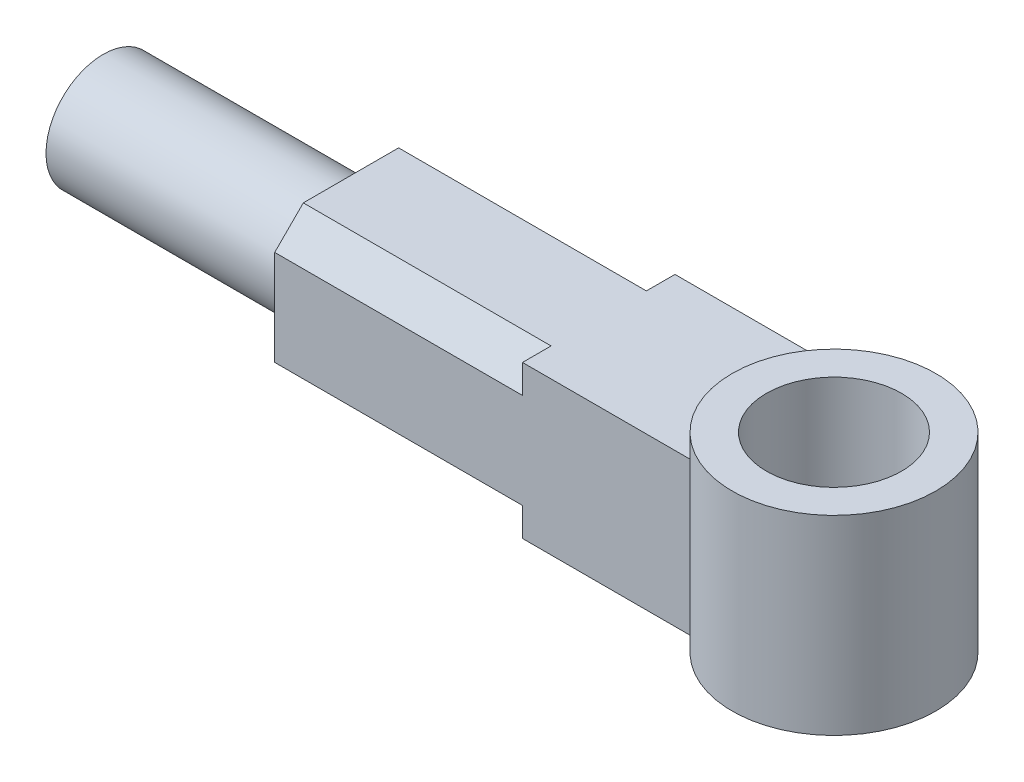
ISO-10303-21;
HEADER;
FILE_DESCRIPTION(('STEP AP214'),'2;1');
FILE_NAME('part.step','',(''),(''),'','','');
FILE_SCHEMA(('AUTOMOTIVE_DESIGN { 1 0 10303 214 1 1 1 1 }'));
ENDSEC;
DATA;
#1=APPLICATION_CONTEXT('core data for automotive mechanical design processes');
#2=APPLICATION_PROTOCOL_DEFINITION('international standard','automotive_design',2000,#1);
#3=PRODUCT_CONTEXT('',#1,'mechanical');
#4=PRODUCT('Part','Part','',(#3));
#5=PRODUCT_RELATED_PRODUCT_CATEGORY('part','',(#4));
#6=PRODUCT_DEFINITION_FORMATION('','',#4);
#7=PRODUCT_DEFINITION_CONTEXT('part definition',#1,'design');
#8=PRODUCT_DEFINITION('design','',#6,#7);
#9=PRODUCT_DEFINITION_SHAPE('','',#8);
#10=(LENGTH_UNIT() NAMED_UNIT(*) SI_UNIT(.MILLI.,.METRE.));
#11=(NAMED_UNIT(*) PLANE_ANGLE_UNIT() SI_UNIT($,.RADIAN.));
#12=(NAMED_UNIT(*) SI_UNIT($,.STERADIAN.) SOLID_ANGLE_UNIT());
#13=UNCERTAINTY_MEASURE_WITH_UNIT(LENGTH_MEASURE(1.E-05),#10,'distance_accuracy_value','');
#14=(GEOMETRIC_REPRESENTATION_CONTEXT(3) GLOBAL_UNCERTAINTY_ASSIGNED_CONTEXT((#13)) GLOBAL_UNIT_ASSIGNED_CONTEXT((#10,
#11,#12)) REPRESENTATION_CONTEXT('',''));
#15=CARTESIAN_POINT('',(0.,0.,0.));
#16=DIRECTION('',(0.,0.,1.));
#17=DIRECTION('',(1.,0.,0.));
#18=AXIS2_PLACEMENT_3D('',#15,#16,#17);
#19=CARTESIAN_POINT('',(-140.311288741493,0.,20.));
#20=DIRECTION('',(1.,0.,0.));
#21=DIRECTION('',(0.,0.,-1.));
#22=AXIS2_PLACEMENT_3D('',#19,#20,#21);
#23=PLANE('',#22);
#24=DIRECTION('',(0.,-1.,0.));
#25=VECTOR('',#24,1.);
#26=CARTESIAN_POINT('',(-140.311288741493,0.,-20.));
#27=LINE('',#26,#25);
#28=CARTESIAN_POINT('',(-140.311288741493,12.5,-20.));
#29=VERTEX_POINT('',#28);
#30=CARTESIAN_POINT('',(-140.311288741493,-12.4999999999998,-20.0000000000002));
#31=VERTEX_POINT('',#30);
#32=EDGE_CURVE('E162',#29,#31,#27,.T.);
#33=ORIENTED_EDGE('',*,*,#32,.T.);
#34=DIRECTION('',(0.,0.707106781186552,-0.707106781186543));
#35=VECTOR('',#34,1.);
#36=CARTESIAN_POINT('',(-140.311288741493,-12.4999999999998,-20.0000000000002));
#37=LINE('',#36,#35);
#38=CARTESIAN_POINT('',(-140.311288741493,-19.9999999999999,-12.5000000000002));
#39=VERTEX_POINT('',#38);
#40=EDGE_CURVE('E187',#39,#31,#37,.T.);
#41=ORIENTED_EDGE('',*,*,#40,.F.);
#42=DIRECTION('',(0.,0.,-1.));
#43=VECTOR('',#42,1.);
#44=CARTESIAN_POINT('',(-140.311288741493,-20.,20.));
#45=LINE('',#44,#43);
#46=CARTESIAN_POINT('',(-140.311288741493,-20.,12.5));
#47=VERTEX_POINT('',#46);
#48=EDGE_CURVE('E175',#47,#39,#45,.T.);
#49=ORIENTED_EDGE('',*,*,#48,.F.);
#50=DIRECTION('',(0.,-0.70710678118655,-0.707106781186545));
#51=VECTOR('',#50,1.);
#52=CARTESIAN_POINT('',(-140.311288741493,-20.,12.5));
#53=LINE('',#52,#51);
#54=CARTESIAN_POINT('',(-140.311288741493,-12.5,20.));
#55=VERTEX_POINT('',#54);
#56=EDGE_CURVE('E209',#55,#47,#53,.T.);
#57=ORIENTED_EDGE('',*,*,#56,.F.);
#58=DIRECTION('',(0.,-1.,0.));
#59=VECTOR('',#58,1.);
#60=CARTESIAN_POINT('',(-140.311288741493,0.,20.));
#61=LINE('',#60,#59);
#62=CARTESIAN_POINT('',(-140.311288741493,12.5,20.));
#63=VERTEX_POINT('',#62);
#64=EDGE_CURVE('E180',#63,#55,#61,.T.);
#65=ORIENTED_EDGE('',*,*,#64,.F.);
#66=DIRECTION('',(0.,-0.707106781186547,0.707106781186548));
#67=VECTOR('',#66,1.);
#68=CARTESIAN_POINT('',(-140.311288741493,12.5,20.));
#69=LINE('',#68,#67);
#70=CARTESIAN_POINT('',(-140.311288741493,20.,12.5));
#71=VERTEX_POINT('',#70);
#72=EDGE_CURVE('E230',#71,#63,#69,.T.);
#73=ORIENTED_EDGE('',*,*,#72,.F.);
#74=DIRECTION('',(0.,0.,-1.));
#75=VECTOR('',#74,1.);
#76=CARTESIAN_POINT('',(-140.311288741493,20.,20.));
#77=LINE('',#76,#75);
#78=CARTESIAN_POINT('',(-140.311288741493,20.,-12.5));
#79=VERTEX_POINT('',#78);
#80=EDGE_CURVE('E179',#71,#79,#77,.T.);
#81=ORIENTED_EDGE('',*,*,#80,.T.);
#82=DIRECTION('',(0.,0.70710678118655,0.707106781186545));
#83=VECTOR('',#82,1.);
#84=CARTESIAN_POINT('',(-140.311288741493,20.,-12.5));
#85=LINE('',#84,#83);
#86=EDGE_CURVE('E256',#29,#79,#85,.T.);
#87=ORIENTED_EDGE('',*,*,#86,.F.);
#88=EDGE_LOOP('',(#33,#41,#49,#57,#65,#73,#81,#87));
#89=FACE_BOUND('',#88,.T.);
#90=CARTESIAN_POINT('',(-140.311288741493,0.,0.));
#91=DIRECTION('',(1.,0.,0.));
#92=DIRECTION('',(0.,0.,-1.));
#93=AXIS2_PLACEMENT_3D('',#90,#91,#92);
#94=CIRCLE('',#93,15.);
#95=CARTESIAN_POINT('',(-140.311288741493,0.,-15.));
#96=VERTEX_POINT('',#95);
#97=EDGE_CURVE('E60',#96,#96,#94,.F.);
#98=ORIENTED_EDGE('',*,*,#97,.F.);
#99=EDGE_LOOP('',(#98));
#100=FACE_BOUND('',#99,.T.);
#101=ADVANCED_FACE('F50',(#89,#100),#23,.F.);
#102=CARTESIAN_POINT('',(0.,-20.,20.));
#103=DIRECTION('',(0.,-1.,0.));
#104=DIRECTION('',(1.,0.,0.));
#105=AXIS2_PLACEMENT_3D('',#102,#103,#104);
#106=PLANE('',#105);
#107=CARTESIAN_POINT('',(-13.5890665192705,-20.,0.));
#108=DIRECTION('',(0.,-1.,0.));
#109=DIRECTION('',(1.,0.,0.));
#110=AXIS2_PLACEMENT_3D('',#107,#108,#109);
#111=CIRCLE('',#110,26.7222222222222);
#112=CARTESIAN_POINT('',(-31.3112887414927,-20.,20.));
#113=VERTEX_POINT('',#112);
#114=CARTESIAN_POINT('',(-31.3112887414927,-20.,-20.));
#115=VERTEX_POINT('',#114);
#116=EDGE_CURVE('E139',#113,#115,#111,.T.);
#117=ORIENTED_EDGE('',*,*,#116,.F.);
#118=DIRECTION('',(-1.,0.,0.));
#119=VECTOR('',#118,1.);
#120=CARTESIAN_POINT('',(0.,-20.,20.));
#121=LINE('',#120,#119);
#122=CARTESIAN_POINT('',(-75.3112887414927,-20.,20.));
#123=VERTEX_POINT('',#122);
#124=EDGE_CURVE('E169',#113,#123,#121,.T.);
#125=ORIENTED_EDGE('',*,*,#124,.T.);
#126=DIRECTION('',(0.,0.,1.));
#127=VECTOR('',#126,1.);
#128=CARTESIAN_POINT('',(-75.3112887414927,-20.,12.5));
#129=LINE('',#128,#127);
#130=CARTESIAN_POINT('',(-75.3112887414927,-20.,12.5));
#131=VERTEX_POINT('',#130);
#132=EDGE_CURVE('E220',#131,#123,#129,.T.);
#133=ORIENTED_EDGE('',*,*,#132,.F.);
#134=DIRECTION('',(-1.,0.,0.));
#135=VECTOR('',#134,1.);
#136=CARTESIAN_POINT('',(-75.3112887414927,-20.,12.5));
#137=LINE('',#136,#135);
#138=EDGE_CURVE('E226',#131,#47,#137,.T.);
#139=ORIENTED_EDGE('',*,*,#138,.T.);
#140=ORIENTED_EDGE('',*,*,#48,.T.);
#141=DIRECTION('',(-1.,0.,0.));
#142=VECTOR('',#141,1.);
#143=CARTESIAN_POINT('',(-75.3112887414927,-19.9999999999999,-12.5000000000002));
#144=LINE('',#143,#142);
#145=CARTESIAN_POINT('',(-75.3112887414927,-19.9999999999999,-12.5000000000002));
#146=VERTEX_POINT('',#145);
#147=EDGE_CURVE('E203',#146,#39,#144,.T.);
#148=ORIENTED_EDGE('',*,*,#147,.F.);
#149=DIRECTION('',(0.,0.,1.));
#150=VECTOR('',#149,1.);
#151=CARTESIAN_POINT('',(-75.3112887414927,-19.9999999999998,-20.0000000000002));
#152=LINE('',#151,#150);
#153=CARTESIAN_POINT('',(-75.3112887414927,-19.9999999999998,-20.0000000000002));
#154=VERTEX_POINT('',#153);
#155=EDGE_CURVE('E191',#154,#146,#152,.T.);
#156=ORIENTED_EDGE('',*,*,#155,.F.);
#157=DIRECTION('',(-1.,0.,0.));
#158=VECTOR('',#157,1.);
#159=CARTESIAN_POINT('',(0.,-20.,-20.));
#160=LINE('',#159,#158);
#161=EDGE_CURVE('E163',#115,#154,#160,.T.);
#162=ORIENTED_EDGE('',*,*,#161,.F.);
#163=EDGE_LOOP('',(#117,#125,#133,#139,#140,#148,#156,#162));
#164=FACE_BOUND('',#163,.T.);
#165=ADVANCED_FACE('F52',(#164),#106,.T.);
#166=CARTESIAN_POINT('',(0.,20.,20.));
#167=DIRECTION('',(0.,-1.,0.));
#168=DIRECTION('',(1.,0.,0.));
#169=AXIS2_PLACEMENT_3D('',#166,#167,#168);
#170=PLANE('',#169);
#171=DIRECTION('',(-1.,0.,0.));
#172=VECTOR('',#171,1.);
#173=CARTESIAN_POINT('',(0.,20.,20.));
#174=LINE('',#173,#172);
#175=CARTESIAN_POINT('',(-31.3112887414927,20.,20.));
#176=VERTEX_POINT('',#175);
#177=CARTESIAN_POINT('',(-75.3112887414927,19.9999999999999,20.));
#178=VERTEX_POINT('',#177);
#179=EDGE_CURVE('E152',#176,#178,#174,.T.);
#180=ORIENTED_EDGE('',*,*,#179,.F.);
#181=CARTESIAN_POINT('',(-13.5890665192705,20.,0.));
#182=DIRECTION('',(0.,-1.,0.));
#183=DIRECTION('',(1.,0.,0.));
#184=AXIS2_PLACEMENT_3D('',#181,#182,#183);
#185=CIRCLE('',#184,26.7222222222222);
#186=CARTESIAN_POINT('',(-31.3112887414927,20.,-20.));
#187=VERTEX_POINT('',#186);
#188=EDGE_CURVE('E136',#176,#187,#185,.T.);
#189=ORIENTED_EDGE('',*,*,#188,.T.);
#190=DIRECTION('',(-1.,0.,0.));
#191=VECTOR('',#190,1.);
#192=CARTESIAN_POINT('',(0.,20.,-20.));
#193=LINE('',#192,#191);
#194=CARTESIAN_POINT('',(-75.3112887414927,20.,-20.));
#195=VERTEX_POINT('',#194);
#196=EDGE_CURVE('E149',#187,#195,#193,.T.);
#197=ORIENTED_EDGE('',*,*,#196,.T.);
#198=DIRECTION('',(0.,0.,-1.));
#199=VECTOR('',#198,1.);
#200=CARTESIAN_POINT('',(-75.3112887414927,20.,-12.5));
#201=LINE('',#200,#199);
#202=CARTESIAN_POINT('',(-75.3112887414927,20.,-12.5));
#203=VERTEX_POINT('',#202);
#204=EDGE_CURVE('E263',#203,#195,#201,.T.);
#205=ORIENTED_EDGE('',*,*,#204,.F.);
#206=DIRECTION('',(-1.,0.,0.));
#207=VECTOR('',#206,1.);
#208=CARTESIAN_POINT('',(-75.3112887414927,20.,-12.5));
#209=LINE('',#208,#207);
#210=EDGE_CURVE('E171',#203,#79,#209,.T.);
#211=ORIENTED_EDGE('',*,*,#210,.T.);
#212=ORIENTED_EDGE('',*,*,#80,.F.);
#213=DIRECTION('',(-1.,0.,0.));
#214=VECTOR('',#213,1.);
#215=CARTESIAN_POINT('',(-75.3112887414927,20.,12.5));
#216=LINE('',#215,#214);
#217=CARTESIAN_POINT('',(-75.3112887414927,20.,12.5));
#218=VERTEX_POINT('',#217);
#219=EDGE_CURVE('E243',#218,#71,#216,.T.);
#220=ORIENTED_EDGE('',*,*,#219,.F.);
#221=DIRECTION('',(0.,0.,-1.));
#222=VECTOR('',#221,1.);
#223=CARTESIAN_POINT('',(-75.3112887414927,19.9999999999999,20.));
#224=LINE('',#223,#222);
#225=EDGE_CURVE('E233',#178,#218,#224,.T.);
#226=ORIENTED_EDGE('',*,*,#225,.F.);
#227=EDGE_LOOP('',(#180,#189,#197,#205,#211,#212,#220,#226));
#228=FACE_BOUND('',#227,.T.);
#229=ADVANCED_FACE('F147',(#228),#170,.F.);
#230=CARTESIAN_POINT('',(0.,0.,20.));
#231=DIRECTION('',(0.,0.,1.));
#232=DIRECTION('',(1.,0.,0.));
#233=AXIS2_PLACEMENT_3D('',#230,#231,#232);
#234=PLANE('',#233);
#235=DIRECTION('',(0.,-1.,0.));
#236=VECTOR('',#235,1.);
#237=CARTESIAN_POINT('',(-31.3112887414927,0.,20.));
#238=LINE('',#237,#236);
#239=EDGE_CURVE('E185',#176,#113,#238,.T.);
#240=ORIENTED_EDGE('',*,*,#239,.F.);
#241=ORIENTED_EDGE('',*,*,#179,.T.);
#242=DIRECTION('',(0.,1.,0.));
#243=VECTOR('',#242,1.);
#244=CARTESIAN_POINT('',(-75.3112887414927,12.5,20.));
#245=LINE('',#244,#243);
#246=CARTESIAN_POINT('',(-75.3112887414927,12.5,20.));
#247=VERTEX_POINT('',#246);
#248=EDGE_CURVE('E240',#247,#178,#245,.T.);
#249=ORIENTED_EDGE('',*,*,#248,.F.);
#250=DIRECTION('',(-1.,0.,0.));
#251=VECTOR('',#250,1.);
#252=CARTESIAN_POINT('',(-75.3112887414927,12.5,20.));
#253=LINE('',#252,#251);
#254=EDGE_CURVE('E246',#247,#63,#253,.T.);
#255=ORIENTED_EDGE('',*,*,#254,.T.);
#256=ORIENTED_EDGE('',*,*,#64,.T.);
#257=DIRECTION('',(-1.,0.,0.));
#258=VECTOR('',#257,1.);
#259=CARTESIAN_POINT('',(-75.3112887414927,-12.5,20.));
#260=LINE('',#259,#258);
#261=CARTESIAN_POINT('',(-75.3112887414927,-12.5,20.));
#262=VERTEX_POINT('',#261);
#263=EDGE_CURVE('E223',#262,#55,#260,.T.);
#264=ORIENTED_EDGE('',*,*,#263,.F.);
#265=DIRECTION('',(0.,1.,0.));
#266=VECTOR('',#265,1.);
#267=CARTESIAN_POINT('',(-75.3112887414927,-20.,20.));
#268=LINE('',#267,#266);
#269=EDGE_CURVE('E212',#123,#262,#268,.T.);
#270=ORIENTED_EDGE('',*,*,#269,.F.);
#271=ORIENTED_EDGE('',*,*,#124,.F.);
#272=EDGE_LOOP('',(#240,#241,#249,#255,#256,#264,#270,#271));
#273=FACE_BOUND('',#272,.T.);
#274=ADVANCED_FACE('F285',(#273),#234,.T.);
#275=CARTESIAN_POINT('',(0.,0.,-20.));
#276=DIRECTION('',(0.,0.,1.));
#277=DIRECTION('',(1.,0.,0.));
#278=AXIS2_PLACEMENT_3D('',#275,#276,#277);
#279=PLANE('',#278);
#280=ORIENTED_EDGE('',*,*,#196,.F.);
#281=DIRECTION('',(0.,-1.,0.));
#282=VECTOR('',#281,1.);
#283=CARTESIAN_POINT('',(-31.3112887414927,0.,-20.));
#284=LINE('',#283,#282);
#285=EDGE_CURVE('E12',#187,#115,#284,.T.);
#286=ORIENTED_EDGE('',*,*,#285,.T.);
#287=ORIENTED_EDGE('',*,*,#161,.T.);
#288=DIRECTION('',(0.,-1.,0.));
#289=VECTOR('',#288,1.);
#290=CARTESIAN_POINT('',(-75.3112887414927,-12.4999999999998,-20.0000000000002));
#291=LINE('',#290,#289);
#292=CARTESIAN_POINT('',(-75.3112887414927,-12.4999999999998,-20.));
#293=VERTEX_POINT('',#292);
#294=EDGE_CURVE('E201',#293,#154,#291,.T.);
#295=ORIENTED_EDGE('',*,*,#294,.F.);
#296=DIRECTION('',(-1.,0.,0.));
#297=VECTOR('',#296,1.);
#298=CARTESIAN_POINT('',(-75.3112887414927,-12.4999999999998,-20.0000000000002));
#299=LINE('',#298,#297);
#300=EDGE_CURVE('E205',#293,#31,#299,.T.);
#301=ORIENTED_EDGE('',*,*,#300,.T.);
#302=ORIENTED_EDGE('',*,*,#32,.F.);
#303=DIRECTION('',(-1.,0.,0.));
#304=VECTOR('',#303,1.);
#305=CARTESIAN_POINT('',(-75.3112887414927,12.5,-20.));
#306=LINE('',#305,#304);
#307=CARTESIAN_POINT('',(-75.3112887414927,12.5,-20.));
#308=VERTEX_POINT('',#307);
#309=EDGE_CURVE('E266',#308,#29,#306,.T.);
#310=ORIENTED_EDGE('',*,*,#309,.F.);
#311=DIRECTION('',(0.,-1.,0.));
#312=VECTOR('',#311,1.);
#313=CARTESIAN_POINT('',(-75.3112887414927,20.,-20.));
#314=LINE('',#313,#312);
#315=EDGE_CURVE('E160',#195,#308,#314,.T.);
#316=ORIENTED_EDGE('',*,*,#315,.F.);
#317=EDGE_LOOP('',(#280,#286,#287,#295,#301,#302,#310,#316));
#318=FACE_BOUND('',#317,.T.);
#319=ADVANCED_FACE('F157',(#318),#279,.F.);
#320=CARTESIAN_POINT('',(-75.3112887414927,20.,-12.5));
#321=DIRECTION('',(0.,-0.707106781186545,0.70710678118655));
#322=DIRECTION('',(0.,-0.70710678118655,-0.707106781186545));
#323=AXIS2_PLACEMENT_3D('',#320,#321,#322);
#324=PLANE('',#323);
#325=ORIENTED_EDGE('',*,*,#86,.T.);
#326=ORIENTED_EDGE('',*,*,#210,.F.);
#327=DIRECTION('',(0.,0.70710678118655,0.707106781186545));
#328=VECTOR('',#327,1.);
#329=CARTESIAN_POINT('',(-75.3112887414927,20.,-12.5));
#330=LINE('',#329,#328);
#331=EDGE_CURVE('E259',#308,#203,#330,.T.);
#332=ORIENTED_EDGE('',*,*,#331,.F.);
#333=ORIENTED_EDGE('',*,*,#309,.T.);
#334=EDGE_LOOP('',(#325,#326,#332,#333));
#335=FACE_BOUND('',#334,.T.);
#336=ADVANCED_FACE('F334',(#335),#324,.F.);
#337=CARTESIAN_POINT('',(-75.3112887414927,0.,0.));
#338=DIRECTION('',(1.,0.,0.));
#339=DIRECTION('',(0.,0.,-1.));
#340=AXIS2_PLACEMENT_3D('',#337,#338,#339);
#341=PLANE('',#340);
#342=ORIENTED_EDGE('',*,*,#315,.T.);
#343=ORIENTED_EDGE('',*,*,#331,.T.);
#344=ORIENTED_EDGE('',*,*,#204,.T.);
#345=EDGE_LOOP('',(#342,#343,#344));
#346=FACE_BOUND('',#345,.T.);
#347=ADVANCED_FACE('F338',(#346),#341,.F.);
#348=CARTESIAN_POINT('',(-205.311288741493,0.,0.));
#349=DIRECTION('',(1.,0.,0.));
#350=DIRECTION('',(0.,0.,-1.));
#351=AXIS2_PLACEMENT_3D('',#348,#349,#350);
#352=CYLINDRICAL_SURFACE('',#351,15.);
#353=CARTESIAN_POINT('',(-205.311288741493,0.,0.));
#354=DIRECTION('',(-1.,0.,0.));
#355=DIRECTION('',(0.,0.,1.));
#356=AXIS2_PLACEMENT_3D('',#353,#354,#355);
#357=CIRCLE('',#356,15.);
#358=CARTESIAN_POINT('',(-205.311288741493,0.,15.));
#359=VERTEX_POINT('',#358);
#360=EDGE_CURVE('E250',#359,#359,#357,.T.);
#361=ORIENTED_EDGE('',*,*,#360,.F.);
#362=EDGE_LOOP('',(#361));
#363=FACE_BOUND('',#362,.T.);
#364=ORIENTED_EDGE('',*,*,#97,.T.);
#365=EDGE_LOOP('',(#364));
#366=FACE_BOUND('',#365,.T.);
#367=ADVANCED_FACE('F317',(#363,#366),#352,.T.);
#368=CARTESIAN_POINT('',(-205.311288741493,0.,0.));
#369=DIRECTION('',(-1.,0.,0.));
#370=DIRECTION('',(0.,0.,1.));
#371=AXIS2_PLACEMENT_3D('',#368,#369,#370);
#372=PLANE('',#371);
#373=ORIENTED_EDGE('',*,*,#360,.T.);
#374=EDGE_LOOP('',(#373));
#375=FACE_BOUND('',#374,.T.);
#376=ADVANCED_FACE('F310',(#375),#372,.T.);
#377=CARTESIAN_POINT('',(-75.3112887414927,12.5,20.));
#378=DIRECTION('',(0.,-0.707106781186548,-0.707106781186547));
#379=DIRECTION('',(0.,0.707106781186547,-0.707106781186548));
#380=AXIS2_PLACEMENT_3D('',#377,#378,#379);
#381=PLANE('',#380);
#382=ORIENTED_EDGE('',*,*,#72,.T.);
#383=ORIENTED_EDGE('',*,*,#254,.F.);
#384=DIRECTION('',(0.,-0.707106781186547,0.707106781186548));
#385=VECTOR('',#384,1.);
#386=CARTESIAN_POINT('',(-75.3112887414927,12.5,20.));
#387=LINE('',#386,#385);
#388=EDGE_CURVE('E237',#218,#247,#387,.T.);
#389=ORIENTED_EDGE('',*,*,#388,.F.);
#390=ORIENTED_EDGE('',*,*,#219,.T.);
#391=EDGE_LOOP('',(#382,#383,#389,#390));
#392=FACE_BOUND('',#391,.T.);
#393=ADVANCED_FACE('F308',(#392),#381,.F.);
#394=CARTESIAN_POINT('',(-75.3112887414927,0.,0.));
#395=DIRECTION('',(1.,0.,0.));
#396=DIRECTION('',(0.,1.,0.));
#397=AXIS2_PLACEMENT_3D('',#394,#395,#396);
#398=PLANE('',#397);
#399=ORIENTED_EDGE('',*,*,#225,.T.);
#400=ORIENTED_EDGE('',*,*,#388,.T.);
#401=ORIENTED_EDGE('',*,*,#248,.T.);
#402=EDGE_LOOP('',(#399,#400,#401));
#403=FACE_BOUND('',#402,.T.);
#404=ADVANCED_FACE('F305',(#403),#398,.F.);
#405=CARTESIAN_POINT('',(-75.3112887414927,-20.,12.5));
#406=DIRECTION('',(0.,0.707106781186545,-0.70710678118655));
#407=DIRECTION('',(0.,0.70710678118655,0.707106781186545));
#408=AXIS2_PLACEMENT_3D('',#405,#406,#407);
#409=PLANE('',#408);
#410=ORIENTED_EDGE('',*,*,#56,.T.);
#411=ORIENTED_EDGE('',*,*,#138,.F.);
#412=DIRECTION('',(0.,-0.70710678118655,-0.707106781186545));
#413=VECTOR('',#412,1.);
#414=CARTESIAN_POINT('',(-75.3112887414927,-20.,12.5));
#415=LINE('',#414,#413);
#416=EDGE_CURVE('E216',#262,#131,#415,.T.);
#417=ORIENTED_EDGE('',*,*,#416,.F.);
#418=ORIENTED_EDGE('',*,*,#263,.T.);
#419=EDGE_LOOP('',(#410,#411,#417,#418));
#420=FACE_BOUND('',#419,.T.);
#421=ADVANCED_FACE('F297',(#420),#409,.F.);
#422=CARTESIAN_POINT('',(-75.3112887414927,0.,0.));
#423=DIRECTION('',(1.,0.,0.));
#424=DIRECTION('',(0.,0.,1.));
#425=AXIS2_PLACEMENT_3D('',#422,#423,#424);
#426=PLANE('',#425);
#427=ORIENTED_EDGE('',*,*,#269,.T.);
#428=ORIENTED_EDGE('',*,*,#416,.T.);
#429=ORIENTED_EDGE('',*,*,#132,.T.);
#430=EDGE_LOOP('',(#427,#428,#429));
#431=FACE_BOUND('',#430,.T.);
#432=ADVANCED_FACE('F303',(#431),#426,.F.);
#433=CARTESIAN_POINT('',(-75.3112887414927,-12.4999999999998,-20.0000000000002));
#434=DIRECTION('',(0.,0.707106781186543,0.707106781186552));
#435=DIRECTION('',(0.,-0.707106781186552,0.707106781186543));
#436=AXIS2_PLACEMENT_3D('',#433,#434,#435);
#437=PLANE('',#436);
#438=ORIENTED_EDGE('',*,*,#40,.T.);
#439=ORIENTED_EDGE('',*,*,#300,.F.);
#440=DIRECTION('',(0.,0.707106781186552,-0.707106781186543));
#441=VECTOR('',#440,1.);
#442=CARTESIAN_POINT('',(-75.3112887414927,-12.4999999999998,-20.0000000000002));
#443=LINE('',#442,#441);
#444=EDGE_CURVE('E67',#146,#293,#443,.T.);
#445=ORIENTED_EDGE('',*,*,#444,.F.);
#446=ORIENTED_EDGE('',*,*,#147,.T.);
#447=EDGE_LOOP('',(#438,#439,#445,#446));
#448=FACE_BOUND('',#447,.T.);
#449=ADVANCED_FACE('F383',(#448),#437,.F.);
#450=CARTESIAN_POINT('',(-75.3112887414927,0.,0.));
#451=DIRECTION('',(1.,0.,0.));
#452=DIRECTION('',(0.,-1.,0.));
#453=AXIS2_PLACEMENT_3D('',#450,#451,#452);
#454=PLANE('',#453);
#455=ORIENTED_EDGE('',*,*,#155,.T.);
#456=ORIENTED_EDGE('',*,*,#444,.T.);
#457=ORIENTED_EDGE('',*,*,#294,.T.);
#458=EDGE_LOOP('',(#455,#456,#457));
#459=FACE_BOUND('',#458,.T.);
#460=ADVANCED_FACE('F392',(#459),#454,.F.);
#461=CARTESIAN_POINT('',(-13.5890665192705,-25.,0.));
#462=DIRECTION('',(0.,1.,0.));
#463=DIRECTION('',(-1.,0.,0.));
#464=AXIS2_PLACEMENT_3D('',#461,#462,#463);
#465=CYLINDRICAL_SURFACE('',#464,26.7222222222222);
#466=CARTESIAN_POINT('',(-13.5890665192705,25.,0.));
#467=DIRECTION('',(0.,1.,0.));
#468=DIRECTION('',(-1.,0.,0.));
#469=AXIS2_PLACEMENT_3D('',#466,#467,#468);
#470=CIRCLE('',#469,26.7222222222222);
#471=CARTESIAN_POINT('',(-40.3112887414927,25.,0.));
#472=VERTEX_POINT('',#471);
#473=EDGE_CURVE('E447',#472,#472,#470,.T.);
#474=ORIENTED_EDGE('',*,*,#473,.F.);
#475=EDGE_LOOP('',(#474));
#476=FACE_BOUND('',#475,.T.);
#477=CARTESIAN_POINT('',(-13.5890665192705,-25.,0.));
#478=DIRECTION('',(0.,1.,0.));
#479=DIRECTION('',(-1.,0.,0.));
#480=AXIS2_PLACEMENT_3D('',#477,#478,#479);
#481=CIRCLE('',#480,26.7222222222222);
#482=CARTESIAN_POINT('',(-40.3112887414927,-25.,0.));
#483=VERTEX_POINT('',#482);
#484=EDGE_CURVE('E154',#483,#483,#481,.T.);
#485=ORIENTED_EDGE('',*,*,#484,.T.);
#486=EDGE_LOOP('',(#485));
#487=FACE_BOUND('',#486,.T.);
#488=ORIENTED_EDGE('',*,*,#239,.T.);
#489=ORIENTED_EDGE('',*,*,#116,.T.);
#490=ORIENTED_EDGE('',*,*,#285,.F.);
#491=ORIENTED_EDGE('',*,*,#188,.F.);
#492=EDGE_LOOP('',(#488,#489,#490,#491));
#493=FACE_BOUND('',#492,.T.);
#494=ADVANCED_FACE('F135',(#476,#487,#493),#465,.T.);
#495=CARTESIAN_POINT('',(-13.5890665192705,-25.,0.));
#496=DIRECTION('',(0.,1.,0.));
#497=DIRECTION('',(-1.,0.,0.));
#498=AXIS2_PLACEMENT_3D('',#495,#496,#497);
#499=PLANE('',#498);
#500=CARTESIAN_POINT('',(-13.5890665192705,-25.,0.));
#501=DIRECTION('',(0.,1.,0.));
#502=DIRECTION('',(-1.,0.,0.));
#503=AXIS2_PLACEMENT_3D('',#500,#501,#502);
#504=CIRCLE('',#503,17.7222222222222);
#505=CARTESIAN_POINT('',(-31.3112887414927,-25.,0.));
#506=VERTEX_POINT('',#505);
#507=EDGE_CURVE('E456',#506,#506,#504,.T.);
#508=ORIENTED_EDGE('',*,*,#507,.T.);
#509=EDGE_LOOP('',(#508));
#510=FACE_BOUND('',#509,.T.);
#511=ORIENTED_EDGE('',*,*,#484,.F.);
#512=EDGE_LOOP('',(#511));
#513=FACE_BOUND('',#512,.T.);
#514=ADVANCED_FACE('F410',(#510,#513),#499,.F.);
#515=CARTESIAN_POINT('',(-13.5890665192705,-25.,0.));
#516=DIRECTION('',(0.,1.,0.));
#517=DIRECTION('',(-1.,0.,0.));
#518=AXIS2_PLACEMENT_3D('',#515,#516,#517);
#519=CYLINDRICAL_SURFACE('',#518,17.7222222222222);
#520=CARTESIAN_POINT('',(-13.5890665192705,25.,0.));
#521=DIRECTION('',(0.,1.,0.));
#522=DIRECTION('',(-1.,0.,0.));
#523=AXIS2_PLACEMENT_3D('',#520,#521,#522);
#524=CIRCLE('',#523,17.7222222222222);
#525=CARTESIAN_POINT('',(-31.3112887414927,25.,0.));
#526=VERTEX_POINT('',#525);
#527=EDGE_CURVE('E450',#526,#526,#524,.T.);
#528=CARTESIAN_POINT('',(-31.3112887414927,-25.,0.));
#529=CARTESIAN_POINT('',(-31.3112887414927,-24.4791666666666,0.));
#530=CARTESIAN_POINT('',(-31.3112887414927,-23.9583333333333,0.));
#531=CARTESIAN_POINT('',(-31.3112887414927,-22.9166666666666,0.));
#532=CARTESIAN_POINT('',(-31.3112887414927,-22.3958333333333,0.));
#533=CARTESIAN_POINT('',(-31.3112887414927,-21.3541666666666,0.));
#534=CARTESIAN_POINT('',(-31.3112887414927,-20.8333333333333,0.));
#535=CARTESIAN_POINT('',(-31.3112887414927,-19.7916666666666,0.));
#536=CARTESIAN_POINT('',(-31.3112887414927,-19.2708333333333,0.));
#537=CARTESIAN_POINT('',(-31.3112887414927,-18.2291666666666,0.));
#538=CARTESIAN_POINT('',(-31.3112887414927,-17.7083333333333,0.));
#539=CARTESIAN_POINT('',(-31.3112887414927,-16.6666666666666,0.));
#540=CARTESIAN_POINT('',(-31.3112887414927,-16.1458333333333,0.));
#541=CARTESIAN_POINT('',(-31.3112887414927,-15.1041666666666,0.));
#542=CARTESIAN_POINT('',(-31.3112887414927,-14.5833333333333,0.));
#543=CARTESIAN_POINT('',(-31.3112887414927,-13.5416666666666,0.));
#544=CARTESIAN_POINT('',(-31.3112887414927,-13.0208333333333,0.));
#545=CARTESIAN_POINT('',(-31.3112887414927,-11.9791666666666,0.));
#546=CARTESIAN_POINT('',(-31.3112887414927,-11.4583333333333,0.));
#547=CARTESIAN_POINT('',(-31.3112887414927,-10.4166666666666,0.));
#548=CARTESIAN_POINT('',(-31.3112887414927,-9.89583333333331,0.));
#549=CARTESIAN_POINT('',(-31.3112887414927,-8.85416666666664,0.));
#550=CARTESIAN_POINT('',(-31.3112887414927,-8.33333333333331,0.));
#551=CARTESIAN_POINT('',(-31.3112887414927,-7.29166666666665,0.));
#552=CARTESIAN_POINT('',(-31.3112887414927,-6.77083333333332,0.));
#553=CARTESIAN_POINT('',(-31.3112887414927,-5.72916666666665,0.));
#554=CARTESIAN_POINT('',(-31.3112887414927,-5.20833333333331,0.));
#555=CARTESIAN_POINT('',(-31.3112887414927,-4.16666666666665,0.));
#556=CARTESIAN_POINT('',(-31.3112887414927,-3.64583333333331,0.));
#557=CARTESIAN_POINT('',(-31.3112887414927,-2.60416666666665,0.));
#558=CARTESIAN_POINT('',(-31.3112887414927,-2.08333333333332,0.));
#559=CARTESIAN_POINT('',(-31.3112887414927,-1.04166666666665,0.));
#560=CARTESIAN_POINT('',(-31.3112887414927,-0.520833333333316,0.));
#561=CARTESIAN_POINT('',(-31.3112887414927,0.520833333333351,0.));
#562=CARTESIAN_POINT('',(-31.3112887414927,1.04166666666669,0.));
#563=CARTESIAN_POINT('',(-31.3112887414927,2.08333333333335,0.));
#564=CARTESIAN_POINT('',(-31.3112887414927,2.60416666666668,0.));
#565=CARTESIAN_POINT('',(-31.3112887414927,3.64583333333335,0.));
#566=CARTESIAN_POINT('',(-31.3112887414927,4.16666666666668,0.));
#567=CARTESIAN_POINT('',(-31.3112887414927,5.20833333333335,0.));
#568=CARTESIAN_POINT('',(-31.3112887414927,5.72916666666668,0.));
#569=CARTESIAN_POINT('',(-31.3112887414927,6.77083333333335,0.));
#570=CARTESIAN_POINT('',(-31.3112887414927,7.29166666666668,0.));
#571=CARTESIAN_POINT('',(-31.3112887414927,8.33333333333335,0.));
#572=CARTESIAN_POINT('',(-31.3112887414927,8.85416666666668,0.));
#573=CARTESIAN_POINT('',(-31.3112887414927,9.89583333333334,0.));
#574=CARTESIAN_POINT('',(-31.3112887414927,10.4166666666667,0.));
#575=CARTESIAN_POINT('',(-31.3112887414927,11.4583333333333,0.));
#576=CARTESIAN_POINT('',(-31.3112887414927,11.9791666666667,0.));
#577=CARTESIAN_POINT('',(-31.3112887414927,13.0208333333333,0.));
#578=CARTESIAN_POINT('',(-31.3112887414927,13.5416666666667,0.));
#579=CARTESIAN_POINT('',(-31.3112887414927,14.5833333333333,0.));
#580=CARTESIAN_POINT('',(-31.3112887414927,15.1041666666667,0.));
#581=CARTESIAN_POINT('',(-31.3112887414927,16.1458333333333,0.));
#582=CARTESIAN_POINT('',(-31.3112887414927,16.6666666666667,0.));
#583=CARTESIAN_POINT('',(-31.3112887414927,17.7083333333333,0.));
#584=CARTESIAN_POINT('',(-31.3112887414927,18.2291666666667,0.));
#585=CARTESIAN_POINT('',(-31.3112887414927,19.2708333333333,0.));
#586=CARTESIAN_POINT('',(-31.3112887414927,19.7916666666667,0.));
#587=CARTESIAN_POINT('',(-31.3112887414927,20.8333333333333,0.));
#588=CARTESIAN_POINT('',(-31.3112887414927,21.3541666666667,0.));
#589=CARTESIAN_POINT('',(-31.3112887414927,22.3958333333333,0.));
#590=CARTESIAN_POINT('',(-31.3112887414927,22.9166666666667,0.));
#591=CARTESIAN_POINT('',(-31.3112887414927,23.9583333333333,0.));
#592=CARTESIAN_POINT('',(-31.3112887414927,24.4791666666667,0.));
#593=CARTESIAN_POINT('',(-31.3112887414927,25.,0.));
#594=B_SPLINE_CURVE_WITH_KNOTS('',3,(#528,#529,#530,#531,#532,#533,#534,#535,#536,#537,#538,
#539,#540,#541,#542,#543,#544,#545,#546,#547,#548,#549,#550,#551,#552,#553,#554,#555,#556,#557,
#558,#559,#560,#561,#562,#563,#564,#565,#566,#567,#568,#569,#570,#571,#572,#573,#574,#575,#576,
#577,#578,#579,#580,#581,#582,#583,#584,#585,#586,#587,#588,#589,#590,#591,#592,#593),
.UNSPECIFIED.,.F.,.F.,(4,2,2,2,2,2,2,2,2,2,2,2,2,2,2,2,2,2,2,2,2,2,2,2,2,2,2,2,2,2,2,2,4),(0.,
1.5625,3.125,4.6875,6.25,7.8125,9.375,10.9375,12.5,14.0625,15.625,17.1875,18.75,20.3125,21.875,
23.4375,25.,26.5625,28.125,29.6875,31.25,32.8125,34.375,35.9375,37.5,39.0625,40.625,42.1875,
43.75,45.3125,46.875,48.4375,50.),.UNSPECIFIED.);
#595=EDGE_CURVE('BSEAM420',#506,#526,#594,.T.);
#596=ORIENTED_EDGE('',*,*,#507,.F.);
#597=ORIENTED_EDGE('',*,*,#527,.T.);
#598=ORIENTED_EDGE('',*,*,#595,.T.);
#599=ORIENTED_EDGE('',*,*,#595,.F.);
#600=EDGE_LOOP('',(#596,#598,#597,#599));
#601=FACE_BOUND('',#600,.T.);
#602=ADVANCED_FACE('F420',(#601),#519,.F.);
#603=CARTESIAN_POINT('',(-13.5890665192705,25.,0.));
#604=DIRECTION('',(0.,1.,0.));
#605=DIRECTION('',(-1.,0.,0.));
#606=AXIS2_PLACEMENT_3D('',#603,#604,#605);
#607=PLANE('',#606);
#608=ORIENTED_EDGE('',*,*,#473,.T.);
#609=EDGE_LOOP('',(#608));
#610=FACE_BOUND('',#609,.T.);
#611=ORIENTED_EDGE('',*,*,#527,.F.);
#612=EDGE_LOOP('',(#611));
#613=FACE_BOUND('',#612,.T.);
#614=ADVANCED_FACE('F430',(#610,#613),#607,.T.);
#615=CLOSED_SHELL('',(#101,#165,#229,#274,#319,#336,#347,#367,#376,#393,#404,#421,#432,#449,
#460,#494,#514,#602,#614));
#616=MANIFOLD_SOLID_BREP('B2',#615);
#617=ADVANCED_BREP_SHAPE_REPRESENTATION('',(#18,#616),#14);
#618=SHAPE_DEFINITION_REPRESENTATION(#9,#617);
ENDSEC;
END-ISO-10303-21;
